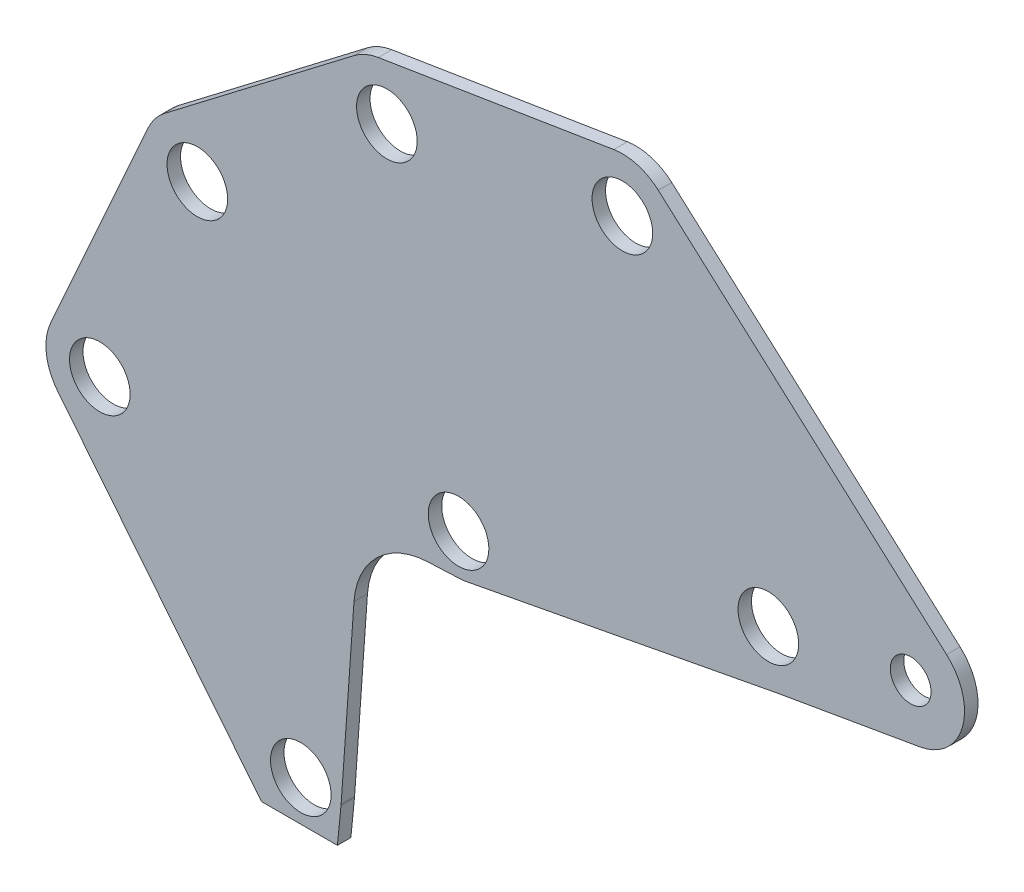
ISO-10303-21;
HEADER;
FILE_DESCRIPTION(('STEP AP214'),'2;1');
FILE_NAME('part.step','',(''),(''),'','','');
FILE_SCHEMA(('AUTOMOTIVE_DESIGN { 1 0 10303 214 1 1 1 1 }'));
ENDSEC;
DATA;
#1=APPLICATION_CONTEXT('core data for automotive mechanical design processes');
#2=APPLICATION_PROTOCOL_DEFINITION('international standard','automotive_design',2000,#1);
#3=PRODUCT_CONTEXT('',#1,'mechanical');
#4=PRODUCT('Part','Part','',(#3));
#5=PRODUCT_RELATED_PRODUCT_CATEGORY('part','',(#4));
#6=PRODUCT_DEFINITION_FORMATION('','',#4);
#7=PRODUCT_DEFINITION_CONTEXT('part definition',#1,'design');
#8=PRODUCT_DEFINITION('design','',#6,#7);
#9=PRODUCT_DEFINITION_SHAPE('','',#8);
#10=(LENGTH_UNIT() NAMED_UNIT(*) SI_UNIT(.MILLI.,.METRE.));
#11=(NAMED_UNIT(*) PLANE_ANGLE_UNIT() SI_UNIT($,.RADIAN.));
#12=(NAMED_UNIT(*) SI_UNIT($,.STERADIAN.) SOLID_ANGLE_UNIT());
#13=UNCERTAINTY_MEASURE_WITH_UNIT(LENGTH_MEASURE(1.E-05),#10,'distance_accuracy_value','');
#14=(GEOMETRIC_REPRESENTATION_CONTEXT(3) GLOBAL_UNCERTAINTY_ASSIGNED_CONTEXT((#13)) GLOBAL_UNIT_ASSIGNED_CONTEXT((#10,
#11,#12)) REPRESENTATION_CONTEXT('',''));
#15=CARTESIAN_POINT('',(0.,0.,0.));
#16=DIRECTION('',(0.,0.,1.));
#17=DIRECTION('',(1.,0.,0.));
#18=AXIS2_PLACEMENT_3D('',#15,#16,#17);
#19=CARTESIAN_POINT('',(-24.2788975585919,128.180879773952,6.35));
#20=DIRECTION('',(-0.186102282927693,0.98253037626788,0.));
#21=DIRECTION('',(-0.98253037626788,-0.186102282927693,0.));
#22=AXIS2_PLACEMENT_3D('',#19,#20,#21);
#23=PLANE('',#22);
#24=DIRECTION('',(0.98253037626788,0.186102282927693,0.));
#25=VECTOR('',#24,1.);
#26=CARTESIAN_POINT('',(-24.2788975585919,128.180879773952,0.));
#27=LINE('',#26,#25);
#28=CARTESIAN_POINT('',(48.4710489323027,141.960536313682,0.));
#29=VERTEX_POINT('',#28);
#30=CARTESIAN_POINT('',(195.460764882071,169.802038611913,0.));
#31=VERTEX_POINT('',#30);
#32=EDGE_CURVE('E243',#29,#31,#27,.T.);
#33=ORIENTED_EDGE('',*,*,#32,.T.);
#34=DIRECTION('',(0.,0.,-1.));
#35=VECTOR('',#34,1.);
#36=CARTESIAN_POINT('',(195.460764882071,169.802038611913,6.35));
#37=LINE('',#36,#35);
#38=CARTESIAN_POINT('',(195.460764882071,169.802038611913,6.35));
#39=VERTEX_POINT('',#38);
#40=EDGE_CURVE('E11',#39,#31,#37,.T.);
#41=ORIENTED_EDGE('',*,*,#40,.F.);
#42=DIRECTION('',(0.98253037626788,0.186102282927693,0.));
#43=VECTOR('',#42,1.);
#44=CARTESIAN_POINT('',(-24.2788975585919,128.180879773952,6.35));
#45=LINE('',#44,#43);
#46=CARTESIAN_POINT('',(48.4710489323027,141.960536313682,6.35));
#47=VERTEX_POINT('',#46);
#48=EDGE_CURVE('E338',#47,#39,#45,.T.);
#49=ORIENTED_EDGE('',*,*,#48,.F.);
#50=DIRECTION('',(0.,0.,-1.));
#51=VECTOR('',#50,1.);
#52=CARTESIAN_POINT('',(48.4710489323027,141.960536313682,6.35));
#53=LINE('',#52,#51);
#54=EDGE_CURVE('E242',#47,#29,#53,.T.);
#55=ORIENTED_EDGE('',*,*,#54,.T.);
#56=EDGE_LOOP('',(#33,#41,#49,#55));
#57=FACE_BOUND('',#56,.T.);
#58=ADVANCED_FACE('F45',(#57),#23,.F.);
#59=CARTESIAN_POINT('',(-22.8648135716955,131.977652859395,6.35));
#60=DIRECTION('',(-0.170704726167307,0.9853222297625,0.));
#61=DIRECTION('',(-0.9853222297625,-0.170704726167307,0.));
#62=AXIS2_PLACEMENT_3D('',#59,#60,#61);
#63=PLANE('',#62);
#64=DIRECTION('',(0.9853222297625,0.170704726167307,0.));
#65=VECTOR('',#64,1.);
#66=CARTESIAN_POINT('',(-22.8648135716955,131.977652859395,0.));
#67=LINE('',#66,#65);
#68=CARTESIAN_POINT('',(262.356708478793,181.391601259186,0.));
#69=VERTEX_POINT('',#68);
#70=EDGE_CURVE('E247',#31,#69,#67,.T.);
#71=ORIENTED_EDGE('',*,*,#70,.T.);
#72=DIRECTION('',(0.,0.,-1.));
#73=VECTOR('',#72,1.);
#74=CARTESIAN_POINT('',(262.356708478793,181.391601259186,6.35));
#75=LINE('',#74,#73);
#76=CARTESIAN_POINT('',(262.356708478793,181.391601259186,6.35));
#77=VERTEX_POINT('',#76);
#78=EDGE_CURVE('E54',#77,#69,#75,.T.);
#79=ORIENTED_EDGE('',*,*,#78,.F.);
#80=DIRECTION('',(0.9853222297625,0.170704726167307,0.));
#81=VECTOR('',#80,1.);
#82=CARTESIAN_POINT('',(-22.8648135716955,131.977652859395,6.35));
#83=LINE('',#82,#81);
#84=EDGE_CURVE('E134',#39,#77,#83,.T.);
#85=ORIENTED_EDGE('',*,*,#84,.F.);
#86=ORIENTED_EDGE('',*,*,#40,.T.);
#87=EDGE_LOOP('',(#71,#79,#85,#86));
#88=FACE_BOUND('',#87,.T.);
#89=ADVANCED_FACE('F483',(#88),#63,.F.);
#90=CARTESIAN_POINT('',(258.020808434144,206.418785895153,6.35));
#91=DIRECTION('',(0.,0.,-1.));
#92=DIRECTION('',(-1.,0.,0.));
#93=AXIS2_PLACEMENT_3D('',#90,#91,#92);
#94=CYLINDRICAL_SURFACE('',#93,25.3999999999999);
#95=CARTESIAN_POINT('',(258.020808434144,206.418785895153,0.));
#96=DIRECTION('',(0.,0.,1.));
#97=DIRECTION('',(1.,0.,0.));
#98=AXIS2_PLACEMENT_3D('',#95,#96,#97);
#99=CIRCLE('',#98,25.3999999999999);
#100=CARTESIAN_POINT('',(274.959289816354,225.346222289565,0.));
#101=VERTEX_POINT('',#100);
#102=EDGE_CURVE('E250',#69,#101,#99,.T.);
#103=ORIENTED_EDGE('',*,*,#102,.T.);
#104=DIRECTION('',(0.,0.,-1.));
#105=VECTOR('',#104,1.);
#106=CARTESIAN_POINT('',(274.959289816354,225.346222289565,6.35));
#107=LINE('',#106,#105);
#108=CARTESIAN_POINT('',(274.959289816354,225.346222289565,6.35));
#109=VERTEX_POINT('',#108);
#110=EDGE_CURVE('E387',#109,#101,#107,.T.);
#111=ORIENTED_EDGE('',*,*,#110,.F.);
#112=CARTESIAN_POINT('',(258.020808434144,206.418785895153,6.35));
#113=DIRECTION('',(0.,0.,1.));
#114=DIRECTION('',(1.,0.,0.));
#115=AXIS2_PLACEMENT_3D('',#112,#113,#114);
#116=CIRCLE('',#115,25.3999999999999);
#117=EDGE_CURVE('E397',#77,#109,#116,.T.);
#118=ORIENTED_EDGE('',*,*,#117,.F.);
#119=ORIENTED_EDGE('',*,*,#78,.T.);
#120=EDGE_LOOP('',(#103,#111,#118,#119));
#121=FACE_BOUND('',#120,.T.);
#122=ADVANCED_FACE('F395',(#121),#94,.T.);
#123=CARTESIAN_POINT('',(234.260675669341,261.768097056212,6.35));
#124=DIRECTION('',(-0.666869345756326,-0.745174661197312,0.));
#125=DIRECTION('',(0.745174661197312,-0.666869345756326,0.));
#126=AXIS2_PLACEMENT_3D('',#123,#124,#125);
#127=PLANE('',#126);
#128=DIRECTION('',(-0.745174661197312,0.666869345756326,0.));
#129=VECTOR('',#128,1.);
#130=CARTESIAN_POINT('',(234.260675669341,261.768097056212,0.));
#131=LINE('',#130,#129);
#132=CARTESIAN_POINT('',(139.078522700688,346.948207684099,0.));
#133=VERTEX_POINT('',#132);
#134=EDGE_CURVE('E253',#101,#133,#131,.T.);
#135=ORIENTED_EDGE('',*,*,#134,.T.);
#136=DIRECTION('',(0.,0.,-1.));
#137=VECTOR('',#136,1.);
#138=CARTESIAN_POINT('',(139.078522700688,346.948207684099,6.35));
#139=LINE('',#138,#137);
#140=CARTESIAN_POINT('',(139.078522700688,346.948207684099,6.35));
#141=VERTEX_POINT('',#140);
#142=EDGE_CURVE('E383',#141,#133,#139,.T.);
#143=ORIENTED_EDGE('',*,*,#142,.F.);
#144=DIRECTION('',(-0.745174661197312,0.666869345756326,0.));
#145=VECTOR('',#144,1.);
#146=CARTESIAN_POINT('',(234.260675669341,261.768097056212,6.35));
#147=LINE('',#146,#145);
#148=EDGE_CURVE('E417',#109,#141,#147,.T.);
#149=ORIENTED_EDGE('',*,*,#148,.F.);
#150=ORIENTED_EDGE('',*,*,#110,.T.);
#151=EDGE_LOOP('',(#135,#143,#149,#150));
#152=FACE_BOUND('',#151,.T.);
#153=ADVANCED_FACE('F406',(#152),#127,.F.);
#154=CARTESIAN_POINT('',(122.140041318477,328.020771289687,6.35));
#155=DIRECTION('',(0.,0.,-1.));
#156=DIRECTION('',(-1.,0.,0.));
#157=AXIS2_PLACEMENT_3D('',#154,#155,#156);
#158=CYLINDRICAL_SURFACE('',#157,25.4);
#159=CARTESIAN_POINT('',(122.140041318477,328.020771289687,0.));
#160=DIRECTION('',(0.,0.,1.));
#161=DIRECTION('',(1.,0.,0.));
#162=AXIS2_PLACEMENT_3D('',#159,#160,#161);
#163=CIRCLE('',#162,25.4);
#164=CARTESIAN_POINT('',(118.089786950744,353.095767591913,0.));
#165=VERTEX_POINT('',#164);
#166=EDGE_CURVE('E256',#133,#165,#163,.T.);
#167=ORIENTED_EDGE('',*,*,#166,.T.);
#168=DIRECTION('',(0.,0.,-1.));
#169=VECTOR('',#168,1.);
#170=CARTESIAN_POINT('',(118.089786950744,353.095767591913,6.35));
#171=LINE('',#170,#169);
#172=CARTESIAN_POINT('',(118.089786950744,353.095767591913,6.35));
#173=VERTEX_POINT('',#172);
#174=EDGE_CURVE('E380',#173,#165,#171,.T.);
#175=ORIENTED_EDGE('',*,*,#174,.F.);
#176=CARTESIAN_POINT('',(122.140041318477,328.020771289687,6.35));
#177=DIRECTION('',(0.,0.,1.));
#178=DIRECTION('',(1.,0.,0.));
#179=AXIS2_PLACEMENT_3D('',#176,#177,#178);
#180=CIRCLE('',#179,25.4);
#181=EDGE_CURVE('E412',#141,#173,#180,.T.);
#182=ORIENTED_EDGE('',*,*,#181,.F.);
#183=ORIENTED_EDGE('',*,*,#142,.T.);
#184=EDGE_LOOP('',(#167,#175,#182,#183));
#185=FACE_BOUND('',#184,.T.);
#186=ADVANCED_FACE('F410',(#185),#158,.T.);
#187=CARTESIAN_POINT('',(-52.581119586597,325.528043301301,6.35));
#188=DIRECTION('',(-0.159458833375334,0.987204578827802,0.));
#189=DIRECTION('',(-0.987204578827802,-0.159458833375334,0.));
#190=AXIS2_PLACEMENT_3D('',#187,#188,#189);
#191=PLANE('',#190);
#192=DIRECTION('',(0.987204578827802,0.159458833375334,0.));
#193=VECTOR('',#192,1.);
#194=CARTESIAN_POINT('',(-52.581119586597,325.528043301301,0.));
#195=LINE('',#194,#193);
#196=CARTESIAN_POINT('',(7.09196141130912,335.166774810363,0.));
#197=VERTEX_POINT('',#196);
#198=EDGE_CURVE('E260',#197,#165,#195,.T.);
#199=ORIENTED_EDGE('',*,*,#198,.F.);
#200=DIRECTION('',(0.,0.,-1.));
#201=VECTOR('',#200,1.);
#202=CARTESIAN_POINT('',(7.09196141130912,335.166774810363,6.35));
#203=LINE('',#202,#201);
#204=CARTESIAN_POINT('',(7.09196141130912,335.166774810363,6.35));
#205=VERTEX_POINT('',#204);
#206=EDGE_CURVE('E377',#205,#197,#203,.T.);
#207=ORIENTED_EDGE('',*,*,#206,.F.);
#208=DIRECTION('',(0.987204578827802,0.159458833375334,0.));
#209=VECTOR('',#208,1.);
#210=CARTESIAN_POINT('',(-52.581119586597,325.528043301301,6.35));
#211=LINE('',#210,#209);
#212=EDGE_CURVE('E416',#205,#173,#211,.T.);
#213=ORIENTED_EDGE('',*,*,#212,.T.);
#214=ORIENTED_EDGE('',*,*,#174,.T.);
#215=EDGE_LOOP('',(#199,#207,#213,#214));
#216=FACE_BOUND('',#215,.T.);
#217=ADVANCED_FACE('F496',(#216),#191,.T.);
#218=CARTESIAN_POINT('',(11.1422157790426,310.091778508137,6.35));
#219=DIRECTION('',(0.,0.,-1.));
#220=DIRECTION('',(-1.,0.,0.));
#221=AXIS2_PLACEMENT_3D('',#218,#219,#220);
#222=CYLINDRICAL_SURFACE('',#221,25.4);
#223=CARTESIAN_POINT('',(11.1422157790426,310.091778508137,0.));
#224=DIRECTION('',(0.,0.,1.));
#225=DIRECTION('',(1.,0.,0.));
#226=AXIS2_PLACEMENT_3D('',#223,#224,#225);
#227=CIRCLE('',#226,25.4);
#228=CARTESIAN_POINT('',(-4.28191443101845,330.272368372238,0.));
#229=VERTEX_POINT('',#228);
#230=EDGE_CURVE('E264',#197,#229,#227,.T.);
#231=ORIENTED_EDGE('',*,*,#230,.T.);
#232=DIRECTION('',(0.,0.,-1.));
#233=VECTOR('',#232,1.);
#234=CARTESIAN_POINT('',(-4.28191443101845,330.272368372238,6.35));
#235=LINE('',#234,#233);
#236=CARTESIAN_POINT('',(-4.28191443101845,330.272368372238,6.35));
#237=VERTEX_POINT('',#236);
#238=EDGE_CURVE('E374',#237,#229,#235,.T.);
#239=ORIENTED_EDGE('',*,*,#238,.F.);
#240=CARTESIAN_POINT('',(11.1422157790426,310.091778508137,6.35));
#241=DIRECTION('',(0.,0.,1.));
#242=DIRECTION('',(1.,0.,0.));
#243=AXIS2_PLACEMENT_3D('',#240,#241,#242);
#244=CIRCLE('',#243,25.4);
#245=EDGE_CURVE('E421',#205,#237,#244,.T.);
#246=ORIENTED_EDGE('',*,*,#245,.F.);
#247=ORIENTED_EDGE('',*,*,#206,.T.);
#248=EDGE_LOOP('',(#231,#239,#246,#247));
#249=FACE_BOUND('',#248,.T.);
#250=ADVANCED_FACE('F499',(#249),#222,.T.);
#251=CARTESIAN_POINT('',(-160.924295309052,210.549778728086,6.35));
#252=DIRECTION('',(-0.607249220868547,0.794511411972504,0.));
#253=DIRECTION('',(-0.794511411972504,-0.607249220868547,0.));
#254=AXIS2_PLACEMENT_3D('',#251,#252,#253);
#255=PLANE('',#254);
#256=DIRECTION('',(0.794511411972504,0.607249220868547,0.));
#257=VECTOR('',#256,1.);
#258=CARTESIAN_POINT('',(-160.924295309052,210.549778728086,0.));
#259=LINE('',#258,#257);
#260=CARTESIAN_POINT('',(-93.6139951228733,261.995392634384,0.));
#261=VERTEX_POINT('',#260);
#262=EDGE_CURVE('E268',#261,#229,#259,.T.);
#263=ORIENTED_EDGE('',*,*,#262,.F.);
#264=DIRECTION('',(0.,0.,-1.));
#265=VECTOR('',#264,1.);
#266=CARTESIAN_POINT('',(-93.6139951228733,261.995392634384,6.35));
#267=LINE('',#266,#265);
#268=CARTESIAN_POINT('',(-93.6139951228733,261.995392634384,6.35));
#269=VERTEX_POINT('',#268);
#270=EDGE_CURVE('E371',#269,#261,#267,.T.);
#271=ORIENTED_EDGE('',*,*,#270,.F.);
#272=DIRECTION('',(0.794511411972504,0.607249220868547,0.));
#273=VECTOR('',#272,1.);
#274=CARTESIAN_POINT('',(-160.924295309052,210.549778728086,6.35));
#275=LINE('',#274,#273);
#276=EDGE_CURVE('E428',#269,#237,#275,.T.);
#277=ORIENTED_EDGE('',*,*,#276,.T.);
#278=ORIENTED_EDGE('',*,*,#238,.T.);
#279=EDGE_LOOP('',(#263,#271,#277,#278));
#280=FACE_BOUND('',#279,.T.);
#281=ADVANCED_FACE('F503',(#280),#255,.T.);
#282=CARTESIAN_POINT('',(-78.1898649128122,241.814802770283,6.35));
#283=DIRECTION('',(0.,0.,-1.));
#284=DIRECTION('',(-1.,0.,0.));
#285=AXIS2_PLACEMENT_3D('',#282,#283,#284);
#286=CYLINDRICAL_SURFACE('',#285,25.4);
#287=CARTESIAN_POINT('',(-78.1898649128122,241.814802770283,0.));
#288=DIRECTION('',(0.,0.,1.));
#289=DIRECTION('',(1.,0.,0.));
#290=AXIS2_PLACEMENT_3D('',#287,#288,#289);
#291=CIRCLE('',#290,25.4);
#292=CARTESIAN_POINT('',(-101.370449501431,252.198467736463,0.));
#293=VERTEX_POINT('',#292);
#294=EDGE_CURVE('E272',#261,#293,#291,.T.);
#295=ORIENTED_EDGE('',*,*,#294,.T.);
#296=DIRECTION('',(0.,0.,-1.));
#297=VECTOR('',#296,1.);
#298=CARTESIAN_POINT('',(-101.370449501431,252.198467736463,6.35));
#299=LINE('',#298,#297);
#300=CARTESIAN_POINT('',(-101.370449501431,252.198467736463,6.35));
#301=VERTEX_POINT('',#300);
#302=EDGE_CURVE('E368',#301,#293,#299,.T.);
#303=ORIENTED_EDGE('',*,*,#302,.F.);
#304=CARTESIAN_POINT('',(-78.1898649128122,241.814802770283,6.35));
#305=DIRECTION('',(0.,0.,1.));
#306=DIRECTION('',(1.,0.,0.));
#307=AXIS2_PLACEMENT_3D('',#304,#305,#306);
#308=CIRCLE('',#307,25.4);
#309=EDGE_CURVE('E432',#269,#301,#308,.T.);
#310=ORIENTED_EDGE('',*,*,#309,.F.);
#311=ORIENTED_EDGE('',*,*,#270,.T.);
#312=EDGE_LOOP('',(#295,#303,#310,#311));
#313=FACE_BOUND('',#312,.T.);
#314=ADVANCED_FACE('F507',(#313),#286,.T.);
#315=CARTESIAN_POINT('',(-178.520634849647,79.9677184473895,6.35));
#316=DIRECTION('',(-0.912621440496808,0.408805707329939,0.));
#317=DIRECTION('',(-0.408805707329939,-0.912621440496808,0.));
#318=AXIS2_PLACEMENT_3D('',#315,#316,#317);
#319=PLANE('',#318);
#320=DIRECTION('',(0.408805707329939,0.912621440496808,0.));
#321=VECTOR('',#320,1.);
#322=CARTESIAN_POINT('',(-178.520634849647,79.9677184473895,0.));
#323=LINE('',#322,#321);
#324=CARTESIAN_POINT('',(-147.33513154901,149.586509072238,0.));
#325=VERTEX_POINT('',#324);
#326=EDGE_CURVE('E276',#325,#293,#323,.T.);
#327=ORIENTED_EDGE('',*,*,#326,.F.);
#328=DIRECTION('',(0.,0.,-1.));
#329=VECTOR('',#328,1.);
#330=CARTESIAN_POINT('',(-147.33513154901,149.586509072238,6.35));
#331=LINE('',#330,#329);
#332=CARTESIAN_POINT('',(-147.33513154901,149.586509072238,6.35));
#333=VERTEX_POINT('',#332);
#334=EDGE_CURVE('E365',#333,#325,#331,.T.);
#335=ORIENTED_EDGE('',*,*,#334,.F.);
#336=DIRECTION('',(0.408805707329939,0.912621440496808,0.));
#337=VECTOR('',#336,1.);
#338=CARTESIAN_POINT('',(-178.520634849647,79.9677184473895,6.35));
#339=LINE('',#338,#337);
#340=EDGE_CURVE('E435',#333,#301,#339,.T.);
#341=ORIENTED_EDGE('',*,*,#340,.T.);
#342=ORIENTED_EDGE('',*,*,#302,.T.);
#343=EDGE_LOOP('',(#327,#335,#341,#342));
#344=FACE_BOUND('',#343,.T.);
#345=ADVANCED_FACE('F511',(#344),#319,.T.);
#346=CARTESIAN_POINT('',(-124.154546960391,139.202844106058,6.35));
#347=DIRECTION('',(0.,0.,-1.));
#348=DIRECTION('',(-1.,0.,0.));
#349=AXIS2_PLACEMENT_3D('',#346,#347,#348);
#350=CYLINDRICAL_SURFACE('',#349,25.4);
#351=CARTESIAN_POINT('',(-124.154546960391,139.202844106058,0.));
#352=DIRECTION('',(0.,0.,1.));
#353=DIRECTION('',(1.,0.,0.));
#354=AXIS2_PLACEMENT_3D('',#351,#352,#353);
#355=CIRCLE('',#354,25.4);
#356=CARTESIAN_POINT('',(-143.948126213997,123.28511121688,0.));
#357=VERTEX_POINT('',#356);
#358=EDGE_CURVE('E280',#325,#357,#355,.T.);
#359=ORIENTED_EDGE('',*,*,#358,.T.);
#360=DIRECTION('',(0.,0.,-1.));
#361=VECTOR('',#360,1.);
#362=CARTESIAN_POINT('',(-143.948126213997,123.28511121688,6.35));
#363=LINE('',#362,#361);
#364=CARTESIAN_POINT('',(-143.948126213997,123.28511121688,6.35));
#365=VERTEX_POINT('',#364);
#366=EDGE_CURVE('E361',#365,#357,#363,.T.);
#367=ORIENTED_EDGE('',*,*,#366,.F.);
#368=CARTESIAN_POINT('',(-124.154546960391,139.202844106058,6.35));
#369=DIRECTION('',(0.,0.,1.));
#370=DIRECTION('',(1.,0.,0.));
#371=AXIS2_PLACEMENT_3D('',#368,#369,#370);
#372=CIRCLE('',#371,25.4);
#373=EDGE_CURVE('E439',#333,#365,#372,.T.);
#374=ORIENTED_EDGE('',*,*,#373,.F.);
#375=ORIENTED_EDGE('',*,*,#334,.T.);
#376=EDGE_LOOP('',(#359,#367,#374,#375));
#377=FACE_BOUND('',#376,.T.);
#378=ADVANCED_FACE('F515',(#377),#350,.T.);
#379=CARTESIAN_POINT('',(-27.208015935582,-21.8803241474469,6.35));
#380=DIRECTION('',(0.779274773764025,0.626682397211719,0.));
#381=DIRECTION('',(-0.626682397211719,0.779274773764025,0.));
#382=AXIS2_PLACEMENT_3D('',#379,#380,#381);
#383=PLANE('',#382);
#384=DIRECTION('',(0.626682397211719,-0.779274773764025,0.));
#385=VECTOR('',#384,1.);
#386=CARTESIAN_POINT('',(-27.208015935582,-21.8803241474469,0.));
#387=LINE('',#386,#385);
#388=CARTESIAN_POINT('',(-47.963668638702,3.92917143837553,0.));
#389=VERTEX_POINT('',#388);
#390=EDGE_CURVE('E283',#357,#389,#387,.T.);
#391=ORIENTED_EDGE('',*,*,#390,.T.);
#392=DIRECTION('',(0.,0.,-1.));
#393=VECTOR('',#392,1.);
#394=CARTESIAN_POINT('',(-47.963668638702,3.92917143837553,6.35));
#395=LINE('',#394,#393);
#396=CARTESIAN_POINT('',(-47.963668638702,3.92917143837553,6.35));
#397=VERTEX_POINT('',#396);
#398=EDGE_CURVE('E357',#397,#389,#395,.T.);
#399=ORIENTED_EDGE('',*,*,#398,.F.);
#400=DIRECTION('',(0.626682397211719,-0.779274773764025,0.));
#401=VECTOR('',#400,1.);
#402=CARTESIAN_POINT('',(-27.208015935582,-21.8803241474469,6.35));
#403=LINE('',#402,#401);
#404=EDGE_CURVE('E442',#365,#397,#403,.T.);
#405=ORIENTED_EDGE('',*,*,#404,.F.);
#406=ORIENTED_EDGE('',*,*,#366,.T.);
#407=EDGE_LOOP('',(#391,#399,#405,#406));
#408=FACE_BOUND('',#407,.T.);
#409=ADVANCED_FACE('F519',(#408),#383,.F.);
#410=CARTESIAN_POINT('',(0.,3.92917143837554,6.35));
#411=DIRECTION('',(0.,1.,0.));
#412=DIRECTION('',(-1.,0.,0.));
#413=AXIS2_PLACEMENT_3D('',#410,#411,#412);
#414=PLANE('',#413);
#415=DIRECTION('',(1.,0.,0.));
#416=VECTOR('',#415,1.);
#417=CARTESIAN_POINT('',(0.,3.92917143837554,0.));
#418=LINE('',#417,#416);
#419=CARTESIAN_POINT('',(-12.1701510131518,3.92917143837553,0.));
#420=VERTEX_POINT('',#419);
#421=EDGE_CURVE('E286',#389,#420,#418,.T.);
#422=ORIENTED_EDGE('',*,*,#421,.T.);
#423=DIRECTION('',(0.,0.,-1.));
#424=VECTOR('',#423,1.);
#425=CARTESIAN_POINT('',(-12.1701510131518,3.92917143837553,6.35));
#426=LINE('',#425,#424);
#427=CARTESIAN_POINT('',(-12.1701510131518,3.92917143837553,6.35));
#428=VERTEX_POINT('',#427);
#429=EDGE_CURVE('E353',#428,#420,#426,.T.);
#430=ORIENTED_EDGE('',*,*,#429,.F.);
#431=DIRECTION('',(1.,0.,0.));
#432=VECTOR('',#431,1.);
#433=CARTESIAN_POINT('',(0.,3.92917143837554,6.35));
#434=LINE('',#433,#432);
#435=EDGE_CURVE('E445',#397,#428,#434,.T.);
#436=ORIENTED_EDGE('',*,*,#435,.F.);
#437=ORIENTED_EDGE('',*,*,#398,.T.);
#438=EDGE_LOOP('',(#422,#430,#436,#437));
#439=FACE_BOUND('',#438,.T.);
#440=ADVANCED_FACE('F523',(#439),#414,.F.);
#441=CARTESIAN_POINT('',(-12.4371366468661,1.23037850131177,6.35));
#442=DIRECTION('',(-0.995142272647681,0.0984472304821677,0.));
#443=DIRECTION('',(-0.0984472304821677,-0.995142272647681,0.));
#444=AXIS2_PLACEMENT_3D('',#441,#442,#443);
#445=PLANE('',#444);
#446=DIRECTION('',(0.0984472304821677,0.995142272647681,0.));
#447=VECTOR('',#446,1.);
#448=CARTESIAN_POINT('',(-12.4371366468661,1.23037850131177,0.));
#449=LINE('',#448,#447);
#450=CARTESIAN_POINT('',(-10.4711076625717,21.1037516976902,0.));
#451=VERTEX_POINT('',#450);
#452=EDGE_CURVE('E289',#420,#451,#449,.T.);
#453=ORIENTED_EDGE('',*,*,#452,.T.);
#454=DIRECTION('',(0.,0.,-1.));
#455=VECTOR('',#454,1.);
#456=CARTESIAN_POINT('',(-10.4711076625717,21.1037516976902,6.35));
#457=LINE('',#456,#455);
#458=CARTESIAN_POINT('',(-10.4711076625717,21.1037516976902,6.35));
#459=VERTEX_POINT('',#458);
#460=EDGE_CURVE('E349',#459,#451,#457,.T.);
#461=ORIENTED_EDGE('',*,*,#460,.F.);
#462=DIRECTION('',(0.0984472304821677,0.995142272647681,0.));
#463=VECTOR('',#462,1.);
#464=CARTESIAN_POINT('',(-12.4371366468661,1.23037850131177,6.35));
#465=LINE('',#464,#463);
#466=EDGE_CURVE('E448',#428,#459,#465,.T.);
#467=ORIENTED_EDGE('',*,*,#466,.F.);
#468=ORIENTED_EDGE('',*,*,#429,.T.);
#469=EDGE_LOOP('',(#453,#461,#467,#468));
#470=FACE_BOUND('',#469,.T.);
#471=ADVANCED_FACE('F527',(#470),#445,.F.);
#472=CARTESIAN_POINT('',(-29.42856795651,22.9791714383755,6.35));
#473=DIRECTION('',(0.,0.,-1.));
#474=DIRECTION('',(-1.,0.,0.));
#475=AXIS2_PLACEMENT_3D('',#472,#473,#474);
#476=CYLINDRICAL_SURFACE('',#475,19.05);
#477=CARTESIAN_POINT('',(-29.42856795651,22.9791714383755,0.));
#478=DIRECTION('',(0.,0.,1.));
#479=DIRECTION('',(1.,0.,0.));
#480=AXIS2_PLACEMENT_3D('',#477,#478,#479);
#481=CIRCLE('',#480,19.05);
#482=CARTESIAN_POINT('',(-10.4261992095961,21.6328869192968,0.));
#483=VERTEX_POINT('',#482);
#484=EDGE_CURVE('E292',#451,#483,#481,.T.);
#485=ORIENTED_EDGE('',*,*,#484,.T.);
#486=DIRECTION('',(0.,0.,-1.));
#487=VECTOR('',#486,1.);
#488=CARTESIAN_POINT('',(-10.4261992095961,21.6328869192968,6.35));
#489=LINE('',#488,#487);
#490=CARTESIAN_POINT('',(-10.4261992095961,21.6328869192968,6.35));
#491=VERTEX_POINT('',#490);
#492=EDGE_CURVE('E345',#491,#483,#489,.T.);
#493=ORIENTED_EDGE('',*,*,#492,.F.);
#494=CARTESIAN_POINT('',(-29.42856795651,22.9791714383755,6.35));
#495=DIRECTION('',(0.,0.,1.));
#496=DIRECTION('',(1.,0.,0.));
#497=AXIS2_PLACEMENT_3D('',#494,#495,#496);
#498=CIRCLE('',#497,19.05);
#499=EDGE_CURVE('E451',#459,#491,#498,.T.);
#500=ORIENTED_EDGE('',*,*,#499,.F.);
#501=ORIENTED_EDGE('',*,*,#460,.T.);
#502=EDGE_LOOP('',(#485,#493,#500,#501));
#503=FACE_BOUND('',#502,.T.);
#504=ADVANCED_FACE('F459',(#503),#476,.T.);
#505=CARTESIAN_POINT('',(-11.8991239854212,0.843032078028291,6.35));
#506=DIRECTION('',(-0.997499671754009,0.0706711033637118,0.));
#507=DIRECTION('',(-0.0706711033637118,-0.997499671754009,0.));
#508=AXIS2_PLACEMENT_3D('',#505,#506,#507);
#509=PLANE('',#508);
#510=DIRECTION('',(0.0706711033637118,0.997499671754009,0.));
#511=VECTOR('',#510,1.);
#512=CARTESIAN_POINT('',(-11.8991239854212,0.843032078028291,0.));
#513=LINE('',#512,#511);
#514=CARTESIAN_POINT('',(-4.35450061913636,107.33294058625,0.));
#515=VERTEX_POINT('',#514);
#516=EDGE_CURVE('E295',#483,#515,#513,.T.);
#517=ORIENTED_EDGE('',*,*,#516,.T.);
#518=DIRECTION('',(0.,0.,-1.));
#519=VECTOR('',#518,1.);
#520=CARTESIAN_POINT('',(-4.35450061913636,107.33294058625,6.35));
#521=LINE('',#520,#519);
#522=CARTESIAN_POINT('',(-4.35450061913636,107.33294058625,6.35));
#523=VERTEX_POINT('',#522);
#524=EDGE_CURVE('E193',#523,#515,#521,.T.);
#525=ORIENTED_EDGE('',*,*,#524,.F.);
#526=DIRECTION('',(0.0706711033637118,0.997499671754009,0.));
#527=VECTOR('',#526,1.);
#528=CARTESIAN_POINT('',(-11.8991239854212,0.843032078028291,6.35));
#529=LINE('',#528,#527);
#530=EDGE_CURVE('E199',#491,#523,#529,.T.);
#531=ORIENTED_EDGE('',*,*,#530,.F.);
#532=ORIENTED_EDGE('',*,*,#492,.T.);
#533=EDGE_LOOP('',(#517,#525,#531,#532));
#534=FACE_BOUND('',#533,.T.);
#535=ADVANCED_FACE('F463',(#534),#509,.F.);
#536=CARTESIAN_POINT('',(31.75,104.775,6.35));
#537=DIRECTION('',(0.,0.,-1.));
#538=DIRECTION('',(-1.,0.,0.));
#539=AXIS2_PLACEMENT_3D('',#536,#537,#538);
#540=CYLINDRICAL_SURFACE('',#539,36.195);
#541=CARTESIAN_POINT('',(31.75,104.775,0.));
#542=DIRECTION('',(0.,0.,1.));
#543=DIRECTION('',(1.,0.,0.));
#544=AXIS2_PLACEMENT_3D('',#541,#542,#543);
#545=CIRCLE('',#544,36.195);
#546=CARTESIAN_POINT('',(30.1023338356494,140.932478081454,0.));
#547=VERTEX_POINT('',#546);
#548=EDGE_CURVE('E187',#547,#515,#545,.T.);
#549=ORIENTED_EDGE('',*,*,#548,.F.);
#550=DIRECTION('',(0.,0.,-1.));
#551=VECTOR('',#550,1.);
#552=CARTESIAN_POINT('',(30.1023338356494,140.932478081454,6.35));
#553=LINE('',#552,#551);
#554=CARTESIAN_POINT('',(30.1023338356494,140.932478081454,6.35));
#555=VERTEX_POINT('',#554);
#556=EDGE_CURVE('E182',#555,#547,#553,.T.);
#557=ORIENTED_EDGE('',*,*,#556,.F.);
#558=CARTESIAN_POINT('',(31.75,104.775,6.35));
#559=DIRECTION('',(0.,0.,1.));
#560=DIRECTION('',(1.,0.,0.));
#561=AXIS2_PLACEMENT_3D('',#558,#559,#560);
#562=CIRCLE('',#561,36.195);
#563=EDGE_CURVE('E185',#555,#523,#562,.T.);
#564=ORIENTED_EDGE('',*,*,#563,.T.);
#565=ORIENTED_EDGE('',*,*,#524,.T.);
#566=EDGE_LOOP('',(#549,#557,#564,#565));
#567=FACE_BOUND('',#566,.T.);
#568=ADVANCED_FACE('F184',(#567),#540,.F.);
#569=CARTESIAN_POINT('',(-6.34648789379724,139.271535629695,6.35));
#570=DIRECTION('',(0.0455219274582275,-0.998963339727984,0.));
#571=DIRECTION('',(0.998963339727984,0.0455219274582275,0.));
#572=AXIS2_PLACEMENT_3D('',#569,#570,#571);
#573=PLANE('',#572);
#574=DIRECTION('',(-0.998963339727984,-0.0455219274582275,0.));
#575=VECTOR('',#574,1.);
#576=CARTESIAN_POINT('',(-6.34648789379724,139.271535629695,0.));
#577=LINE('',#576,#575);
#578=CARTESIAN_POINT('',(45.7929931606093,141.647488359767,0.));
#579=VERTEX_POINT('',#578);
#580=EDGE_CURVE('E301',#579,#547,#577,.T.);
#581=ORIENTED_EDGE('',*,*,#580,.F.);
#582=DIRECTION('',(0.,0.,-1.));
#583=VECTOR('',#582,1.);
#584=CARTESIAN_POINT('',(45.7929931606093,141.647488359767,6.35));
#585=LINE('',#584,#583);
#586=CARTESIAN_POINT('',(45.7929931606093,141.647488359767,6.35));
#587=VERTEX_POINT('',#586);
#588=EDGE_CURVE('E123',#587,#579,#585,.T.);
#589=ORIENTED_EDGE('',*,*,#588,.F.);
#590=DIRECTION('',(-0.998963339727984,-0.0455219274582275,0.));
#591=VECTOR('',#590,1.);
#592=CARTESIAN_POINT('',(-6.34648789379724,139.271535629695,6.35));
#593=LINE('',#592,#591);
#594=EDGE_CURVE('E197',#587,#555,#593,.T.);
#595=ORIENTED_EDGE('',*,*,#594,.T.);
#596=ORIENTED_EDGE('',*,*,#556,.T.);
#597=EDGE_LOOP('',(#581,#589,#595,#596));
#598=FACE_BOUND('',#597,.T.);
#599=ADVANCED_FACE('F203',(#598),#573,.T.);
#600=CARTESIAN_POINT('',(122.140041318477,328.020771289687,6.35));
#601=DIRECTION('',(0.,0.,-1.));
#602=DIRECTION('',(-1.,0.,0.));
#603=AXIS2_PLACEMENT_3D('',#600,#601,#602);
#604=CYLINDRICAL_SURFACE('',#603,14.2875);
#605=CARTESIAN_POINT('',(122.140041318477,328.020771289687,6.35));
#606=DIRECTION('',(0.,0.,1.));
#607=DIRECTION('',(1.,0.,0.));
#608=AXIS2_PLACEMENT_3D('',#605,#606,#607);
#609=CIRCLE('',#608,14.2875);
#610=CARTESIAN_POINT('',(136.427541318477,328.020771289687,6.35));
#611=VERTEX_POINT('',#610);
#612=EDGE_CURVE('E234',#611,#611,#609,.T.);
#613=ORIENTED_EDGE('',*,*,#612,.T.);
#614=EDGE_LOOP('',(#613));
#615=FACE_BOUND('',#614,.T.);
#616=CARTESIAN_POINT('',(122.140041318477,328.020771289687,0.));
#617=DIRECTION('',(0.,0.,1.));
#618=DIRECTION('',(1.,0.,0.));
#619=AXIS2_PLACEMENT_3D('',#616,#617,#618);
#620=CIRCLE('',#619,14.2875);
#621=CARTESIAN_POINT('',(136.427541318477,328.020771289687,0.));
#622=VERTEX_POINT('',#621);
#623=EDGE_CURVE('E330',#622,#622,#620,.T.);
#624=ORIENTED_EDGE('',*,*,#623,.F.);
#625=EDGE_LOOP('',(#624));
#626=FACE_BOUND('',#625,.T.);
#627=ADVANCED_FACE('F538',(#615,#626),#604,.F.);
#628=CARTESIAN_POINT('',(11.1422157790426,310.091778508137,6.35));
#629=DIRECTION('',(0.,0.,-1.));
#630=DIRECTION('',(-1.,0.,0.));
#631=AXIS2_PLACEMENT_3D('',#628,#629,#630);
#632=CYLINDRICAL_SURFACE('',#631,14.2875);
#633=CARTESIAN_POINT('',(11.1422157790426,310.091778508137,6.35));
#634=DIRECTION('',(0.,0.,1.));
#635=DIRECTION('',(1.,0.,0.));
#636=AXIS2_PLACEMENT_3D('',#633,#634,#635);
#637=CIRCLE('',#636,14.2875);
#638=CARTESIAN_POINT('',(25.4297157790426,310.091778508137,6.35));
#639=VERTEX_POINT('',#638);
#640=EDGE_CURVE('E230',#639,#639,#637,.T.);
#641=ORIENTED_EDGE('',*,*,#640,.T.);
#642=EDGE_LOOP('',(#641));
#643=FACE_BOUND('',#642,.T.);
#644=CARTESIAN_POINT('',(11.1422157790426,310.091778508137,0.));
#645=DIRECTION('',(0.,0.,1.));
#646=DIRECTION('',(1.,0.,0.));
#647=AXIS2_PLACEMENT_3D('',#644,#645,#646);
#648=CIRCLE('',#647,14.2875);
#649=CARTESIAN_POINT('',(25.4297157790426,310.091778508137,0.));
#650=VERTEX_POINT('',#649);
#651=EDGE_CURVE('E326',#650,#650,#648,.T.);
#652=ORIENTED_EDGE('',*,*,#651,.F.);
#653=EDGE_LOOP('',(#652));
#654=FACE_BOUND('',#653,.T.);
#655=ADVANCED_FACE('F542',(#643,#654),#632,.F.);
#656=CARTESIAN_POINT('',(-78.1898649128122,241.814802770283,6.35));
#657=DIRECTION('',(0.,0.,-1.));
#658=DIRECTION('',(-1.,0.,0.));
#659=AXIS2_PLACEMENT_3D('',#656,#657,#658);
#660=CYLINDRICAL_SURFACE('',#659,14.2875);
#661=CARTESIAN_POINT('',(-78.1898649128122,241.814802770283,6.35));
#662=DIRECTION('',(0.,0.,1.));
#663=DIRECTION('',(1.,0.,0.));
#664=AXIS2_PLACEMENT_3D('',#661,#662,#663);
#665=CIRCLE('',#664,14.2875);
#666=CARTESIAN_POINT('',(-63.9023649128122,241.814802770283,6.35));
#667=VERTEX_POINT('',#666);
#668=EDGE_CURVE('E226',#667,#667,#665,.T.);
#669=ORIENTED_EDGE('',*,*,#668,.T.);
#670=EDGE_LOOP('',(#669));
#671=FACE_BOUND('',#670,.T.);
#672=CARTESIAN_POINT('',(-78.1898649128122,241.814802770283,0.));
#673=DIRECTION('',(0.,0.,1.));
#674=DIRECTION('',(1.,0.,0.));
#675=AXIS2_PLACEMENT_3D('',#672,#673,#674);
#676=CIRCLE('',#675,14.2875);
#677=CARTESIAN_POINT('',(-63.9023649128122,241.814802770283,0.));
#678=VERTEX_POINT('',#677);
#679=EDGE_CURVE('E322',#678,#678,#676,.T.);
#680=ORIENTED_EDGE('',*,*,#679,.F.);
#681=EDGE_LOOP('',(#680));
#682=FACE_BOUND('',#681,.T.);
#683=ADVANCED_FACE('F548',(#671,#682),#660,.F.);
#684=CARTESIAN_POINT('',(-124.154546960391,139.202844106058,6.35));
#685=DIRECTION('',(0.,0.,-1.));
#686=DIRECTION('',(-1.,0.,0.));
#687=AXIS2_PLACEMENT_3D('',#684,#685,#686);
#688=CYLINDRICAL_SURFACE('',#687,14.2875);
#689=CARTESIAN_POINT('',(-124.154546960391,139.202844106058,6.35));
#690=DIRECTION('',(0.,0.,1.));
#691=DIRECTION('',(1.,0.,0.));
#692=AXIS2_PLACEMENT_3D('',#689,#690,#691);
#693=CIRCLE('',#692,14.2875);
#694=CARTESIAN_POINT('',(-109.867046960391,139.202844106058,6.35));
#695=VERTEX_POINT('',#694);
#696=EDGE_CURVE('E222',#695,#695,#693,.T.);
#697=ORIENTED_EDGE('',*,*,#696,.T.);
#698=EDGE_LOOP('',(#697));
#699=FACE_BOUND('',#698,.T.);
#700=CARTESIAN_POINT('',(-124.154546960391,139.202844106058,0.));
#701=DIRECTION('',(0.,0.,1.));
#702=DIRECTION('',(1.,0.,0.));
#703=AXIS2_PLACEMENT_3D('',#700,#701,#702);
#704=CIRCLE('',#703,14.2875);
#705=CARTESIAN_POINT('',(-109.867046960391,139.202844106058,0.));
#706=VERTEX_POINT('',#705);
#707=EDGE_CURVE('E318',#706,#706,#704,.T.);
#708=ORIENTED_EDGE('',*,*,#707,.F.);
#709=EDGE_LOOP('',(#708));
#710=FACE_BOUND('',#709,.T.);
#711=ADVANCED_FACE('F556',(#699,#710),#688,.F.);
#712=CARTESIAN_POINT('',(-29.42856795651,22.9791714383755,6.35));
#713=DIRECTION('',(0.,0.,-1.));
#714=DIRECTION('',(-1.,0.,0.));
#715=AXIS2_PLACEMENT_3D('',#712,#713,#714);
#716=CYLINDRICAL_SURFACE('',#715,14.2875);
#717=CARTESIAN_POINT('',(-29.42856795651,22.9791714383755,6.35));
#718=DIRECTION('',(0.,0.,1.));
#719=DIRECTION('',(1.,0.,0.));
#720=AXIS2_PLACEMENT_3D('',#717,#718,#719);
#721=CIRCLE('',#720,14.2875);
#722=CARTESIAN_POINT('',(-15.14106795651,22.9791714383755,6.35));
#723=VERTEX_POINT('',#722);
#724=EDGE_CURVE('E218',#723,#723,#721,.T.);
#725=ORIENTED_EDGE('',*,*,#724,.T.);
#726=EDGE_LOOP('',(#725));
#727=FACE_BOUND('',#726,.T.);
#728=CARTESIAN_POINT('',(-29.42856795651,22.9791714383755,0.));
#729=DIRECTION('',(0.,0.,1.));
#730=DIRECTION('',(1.,0.,0.));
#731=AXIS2_PLACEMENT_3D('',#728,#729,#730);
#732=CIRCLE('',#731,14.2875);
#733=CARTESIAN_POINT('',(-15.14106795651,22.9791714383755,0.));
#734=VERTEX_POINT('',#733);
#735=EDGE_CURVE('E314',#734,#734,#732,.T.);
#736=ORIENTED_EDGE('',*,*,#735,.F.);
#737=EDGE_LOOP('',(#736));
#738=FACE_BOUND('',#737,.T.);
#739=ADVANCED_FACE('F560',(#727,#738),#716,.F.);
#740=CARTESIAN_POINT('',(44.9258004425301,160.677739981585,6.35));
#741=DIRECTION('',(0.,0.,-1.));
#742=DIRECTION('',(-1.,0.,0.));
#743=AXIS2_PLACEMENT_3D('',#740,#741,#742);
#744=CYLINDRICAL_SURFACE('',#743,14.2875);
#745=CARTESIAN_POINT('',(44.9258004425301,160.677739981585,6.35));
#746=DIRECTION('',(0.,0.,1.));
#747=DIRECTION('',(1.,0.,0.));
#748=AXIS2_PLACEMENT_3D('',#745,#746,#747);
#749=CIRCLE('',#748,14.2875);
#750=CARTESIAN_POINT('',(59.2133004425301,160.677739981585,6.35));
#751=VERTEX_POINT('',#750);
#752=EDGE_CURVE('E214',#751,#751,#749,.T.);
#753=ORIENTED_EDGE('',*,*,#752,.T.);
#754=EDGE_LOOP('',(#753));
#755=FACE_BOUND('',#754,.T.);
#756=CARTESIAN_POINT('',(44.9258004425301,160.677739981585,0.));
#757=DIRECTION('',(0.,0.,1.));
#758=DIRECTION('',(1.,0.,0.));
#759=AXIS2_PLACEMENT_3D('',#756,#757,#758);
#760=CIRCLE('',#759,14.2875);
#761=CARTESIAN_POINT('',(59.2133004425301,160.677739981585,0.));
#762=VERTEX_POINT('',#761);
#763=EDGE_CURVE('E310',#762,#762,#760,.T.);
#764=ORIENTED_EDGE('',*,*,#763,.F.);
#765=EDGE_LOOP('',(#764));
#766=FACE_BOUND('',#765,.T.);
#767=ADVANCED_FACE('F478',(#755,#766),#744,.F.);
#768=CARTESIAN_POINT('',(190.929038439426,194.795296767349,6.35));
#769=DIRECTION('',(0.,0.,-1.));
#770=DIRECTION('',(-1.,0.,0.));
#771=AXIS2_PLACEMENT_3D('',#768,#769,#770);
#772=CYLINDRICAL_SURFACE('',#771,14.2875);
#773=CARTESIAN_POINT('',(190.929038439426,194.795296767349,6.35));
#774=DIRECTION('',(0.,0.,1.));
#775=DIRECTION('',(1.,0.,0.));
#776=AXIS2_PLACEMENT_3D('',#773,#774,#775);
#777=CIRCLE('',#776,14.2875);
#778=CARTESIAN_POINT('',(205.216538439426,194.795296767349,6.35));
#779=VERTEX_POINT('',#778);
#780=EDGE_CURVE('E207',#779,#779,#777,.T.);
#781=ORIENTED_EDGE('',*,*,#780,.T.);
#782=EDGE_LOOP('',(#781));
#783=FACE_BOUND('',#782,.T.);
#784=CARTESIAN_POINT('',(190.929038439426,194.795296767349,0.));
#785=DIRECTION('',(0.,0.,1.));
#786=DIRECTION('',(1.,0.,0.));
#787=AXIS2_PLACEMENT_3D('',#784,#785,#786);
#788=CIRCLE('',#787,14.2875);
#789=CARTESIAN_POINT('',(205.216538439426,194.795296767349,0.));
#790=VERTEX_POINT('',#789);
#791=EDGE_CURVE('E306',#790,#790,#788,.T.);
#792=ORIENTED_EDGE('',*,*,#791,.F.);
#793=EDGE_LOOP('',(#792));
#794=FACE_BOUND('',#793,.T.);
#795=ADVANCED_FACE('F470',(#783,#794),#772,.F.);
#796=CARTESIAN_POINT('',(44.9258004425301,160.677739981585,6.35));
#797=DIRECTION('',(0.,0.,-1.));
#798=DIRECTION('',(-1.,0.,0.));
#799=AXIS2_PLACEMENT_3D('',#796,#797,#798);
#800=CYLINDRICAL_SURFACE('',#799,19.05);
#801=CARTESIAN_POINT('',(44.9258004425301,160.677739981585,0.));
#802=DIRECTION('',(0.,0.,1.));
#803=DIRECTION('',(1.,0.,0.));
#804=AXIS2_PLACEMENT_3D('',#801,#802,#803);
#805=CIRCLE('',#804,19.05);
#806=EDGE_CURVE('E126',#579,#29,#805,.T.);
#807=ORIENTED_EDGE('',*,*,#806,.T.);
#808=ORIENTED_EDGE('',*,*,#54,.F.);
#809=CARTESIAN_POINT('',(44.9258004425301,160.677739981585,6.35));
#810=DIRECTION('',(0.,0.,1.));
#811=DIRECTION('',(1.,0.,0.));
#812=AXIS2_PLACEMENT_3D('',#809,#810,#811);
#813=CIRCLE('',#812,19.05);
#814=EDGE_CURVE('E62',#587,#47,#813,.T.);
#815=ORIENTED_EDGE('',*,*,#814,.F.);
#816=ORIENTED_EDGE('',*,*,#588,.T.);
#817=EDGE_LOOP('',(#807,#808,#815,#816));
#818=FACE_BOUND('',#817,.T.);
#819=ADVANCED_FACE('F467',(#818),#800,.T.);
#820=CARTESIAN_POINT('',(258.020808434144,206.418785895153,6.35));
#821=DIRECTION('',(0.,0.,-1.));
#822=DIRECTION('',(-1.,0.,0.));
#823=AXIS2_PLACEMENT_3D('',#820,#821,#822);
#824=CYLINDRICAL_SURFACE('',#823,9.61307399806282);
#825=CARTESIAN_POINT('',(258.020808434144,206.418785895153,6.35));
#826=DIRECTION('',(0.,0.,1.));
#827=DIRECTION('',(1.,0.,0.));
#828=AXIS2_PLACEMENT_3D('',#825,#826,#827);
#829=CIRCLE('',#828,9.61307399806282);
#830=CARTESIAN_POINT('',(267.633882432207,206.418785895153,6.35));
#831=VERTEX_POINT('',#830);
#832=EDGE_CURVE('E238',#831,#831,#829,.T.);
#833=ORIENTED_EDGE('',*,*,#832,.T.);
#834=EDGE_LOOP('',(#833));
#835=FACE_BOUND('',#834,.T.);
#836=CARTESIAN_POINT('',(258.020808434144,206.418785895153,0.));
#837=DIRECTION('',(0.,0.,1.));
#838=DIRECTION('',(1.,0.,0.));
#839=AXIS2_PLACEMENT_3D('',#836,#837,#838);
#840=CIRCLE('',#839,9.61307399806282);
#841=CARTESIAN_POINT('',(267.633882432207,206.418785895153,0.));
#842=VERTEX_POINT('',#841);
#843=EDGE_CURVE('E334',#842,#842,#840,.T.);
#844=ORIENTED_EDGE('',*,*,#843,.F.);
#845=EDGE_LOOP('',(#844));
#846=FACE_BOUND('',#845,.T.);
#847=ADVANCED_FACE('F469',(#835,#846),#824,.F.);
#848=CARTESIAN_POINT('',(0.,0.,6.35));
#849=DIRECTION('',(0.,0.,1.));
#850=DIRECTION('',(1.,0.,0.));
#851=AXIS2_PLACEMENT_3D('',#848,#849,#850);
#852=PLANE('',#851);
#853=ORIENTED_EDGE('',*,*,#48,.T.);
#854=ORIENTED_EDGE('',*,*,#84,.T.);
#855=ORIENTED_EDGE('',*,*,#117,.T.);
#856=ORIENTED_EDGE('',*,*,#148,.T.);
#857=ORIENTED_EDGE('',*,*,#181,.T.);
#858=ORIENTED_EDGE('',*,*,#212,.F.);
#859=ORIENTED_EDGE('',*,*,#245,.T.);
#860=ORIENTED_EDGE('',*,*,#276,.F.);
#861=ORIENTED_EDGE('',*,*,#309,.T.);
#862=ORIENTED_EDGE('',*,*,#340,.F.);
#863=ORIENTED_EDGE('',*,*,#373,.T.);
#864=ORIENTED_EDGE('',*,*,#404,.T.);
#865=ORIENTED_EDGE('',*,*,#435,.T.);
#866=ORIENTED_EDGE('',*,*,#466,.T.);
#867=ORIENTED_EDGE('',*,*,#499,.T.);
#868=ORIENTED_EDGE('',*,*,#530,.T.);
#869=ORIENTED_EDGE('',*,*,#563,.F.);
#870=ORIENTED_EDGE('',*,*,#594,.F.);
#871=ORIENTED_EDGE('',*,*,#814,.T.);
#872=EDGE_LOOP('',(#853,#854,#855,#856,#857,#858,#859,#860,#861,#862,#863,#864,#865,#866,#867,
#868,#869,#870,#871));
#873=FACE_BOUND('',#872,.T.);
#874=ORIENTED_EDGE('',*,*,#780,.F.);
#875=EDGE_LOOP('',(#874));
#876=FACE_BOUND('',#875,.T.);
#877=ORIENTED_EDGE('',*,*,#752,.F.);
#878=EDGE_LOOP('',(#877));
#879=FACE_BOUND('',#878,.T.);
#880=ORIENTED_EDGE('',*,*,#724,.F.);
#881=EDGE_LOOP('',(#880));
#882=FACE_BOUND('',#881,.T.);
#883=ORIENTED_EDGE('',*,*,#696,.F.);
#884=EDGE_LOOP('',(#883));
#885=FACE_BOUND('',#884,.T.);
#886=ORIENTED_EDGE('',*,*,#668,.F.);
#887=EDGE_LOOP('',(#886));
#888=FACE_BOUND('',#887,.T.);
#889=ORIENTED_EDGE('',*,*,#640,.F.);
#890=EDGE_LOOP('',(#889));
#891=FACE_BOUND('',#890,.T.);
#892=ORIENTED_EDGE('',*,*,#612,.F.);
#893=EDGE_LOOP('',(#892));
#894=FACE_BOUND('',#893,.T.);
#895=ORIENTED_EDGE('',*,*,#832,.F.);
#896=EDGE_LOOP('',(#895));
#897=FACE_BOUND('',#896,.T.);
#898=ADVANCED_FACE('F195',(#873,#876,#879,#882,#885,#888,#891,#894,#897),#852,.T.);
#899=CARTESIAN_POINT('',(0.,0.,0.));
#900=DIRECTION('',(0.,0.,1.));
#901=DIRECTION('',(1.,0.,0.));
#902=AXIS2_PLACEMENT_3D('',#899,#900,#901);
#903=PLANE('',#902);
#904=ORIENTED_EDGE('',*,*,#32,.F.);
#905=ORIENTED_EDGE('',*,*,#806,.F.);
#906=ORIENTED_EDGE('',*,*,#580,.T.);
#907=ORIENTED_EDGE('',*,*,#548,.T.);
#908=ORIENTED_EDGE('',*,*,#516,.F.);
#909=ORIENTED_EDGE('',*,*,#484,.F.);
#910=ORIENTED_EDGE('',*,*,#452,.F.);
#911=ORIENTED_EDGE('',*,*,#421,.F.);
#912=ORIENTED_EDGE('',*,*,#390,.F.);
#913=ORIENTED_EDGE('',*,*,#358,.F.);
#914=ORIENTED_EDGE('',*,*,#326,.T.);
#915=ORIENTED_EDGE('',*,*,#294,.F.);
#916=ORIENTED_EDGE('',*,*,#262,.T.);
#917=ORIENTED_EDGE('',*,*,#230,.F.);
#918=ORIENTED_EDGE('',*,*,#198,.T.);
#919=ORIENTED_EDGE('',*,*,#166,.F.);
#920=ORIENTED_EDGE('',*,*,#134,.F.);
#921=ORIENTED_EDGE('',*,*,#102,.F.);
#922=ORIENTED_EDGE('',*,*,#70,.F.);
#923=EDGE_LOOP('',(#904,#905,#906,#907,#908,#909,#910,#911,#912,#913,#914,#915,#916,#917,#918,
#919,#920,#921,#922));
#924=FACE_BOUND('',#923,.T.);
#925=ORIENTED_EDGE('',*,*,#791,.T.);
#926=EDGE_LOOP('',(#925));
#927=FACE_BOUND('',#926,.T.);
#928=ORIENTED_EDGE('',*,*,#763,.T.);
#929=EDGE_LOOP('',(#928));
#930=FACE_BOUND('',#929,.T.);
#931=ORIENTED_EDGE('',*,*,#735,.T.);
#932=EDGE_LOOP('',(#931));
#933=FACE_BOUND('',#932,.T.);
#934=ORIENTED_EDGE('',*,*,#707,.T.);
#935=EDGE_LOOP('',(#934));
#936=FACE_BOUND('',#935,.T.);
#937=ORIENTED_EDGE('',*,*,#679,.T.);
#938=EDGE_LOOP('',(#937));
#939=FACE_BOUND('',#938,.T.);
#940=ORIENTED_EDGE('',*,*,#651,.T.);
#941=EDGE_LOOP('',(#940));
#942=FACE_BOUND('',#941,.T.);
#943=ORIENTED_EDGE('',*,*,#623,.T.);
#944=EDGE_LOOP('',(#943));
#945=FACE_BOUND('',#944,.T.);
#946=ORIENTED_EDGE('',*,*,#843,.T.);
#947=EDGE_LOOP('',(#946));
#948=FACE_BOUND('',#947,.T.);
#949=ADVANCED_FACE('F401',(#924,#927,#930,#933,#936,#939,#942,#945,#948),#903,.F.);
#950=CLOSED_SHELL('',(#58,#89,#122,#153,#186,#217,#250,#281,#314,#345,#378,#409,#440,#471,#504,
#535,#568,#599,#627,#655,#683,#711,#739,#767,#795,#819,#847,#898,#949));
#951=MANIFOLD_SOLID_BREP('B2',#950);
#952=ADVANCED_BREP_SHAPE_REPRESENTATION('',(#18,#951),#14);
#953=SHAPE_DEFINITION_REPRESENTATION(#9,#952);
ENDSEC;
END-ISO-10303-21;
